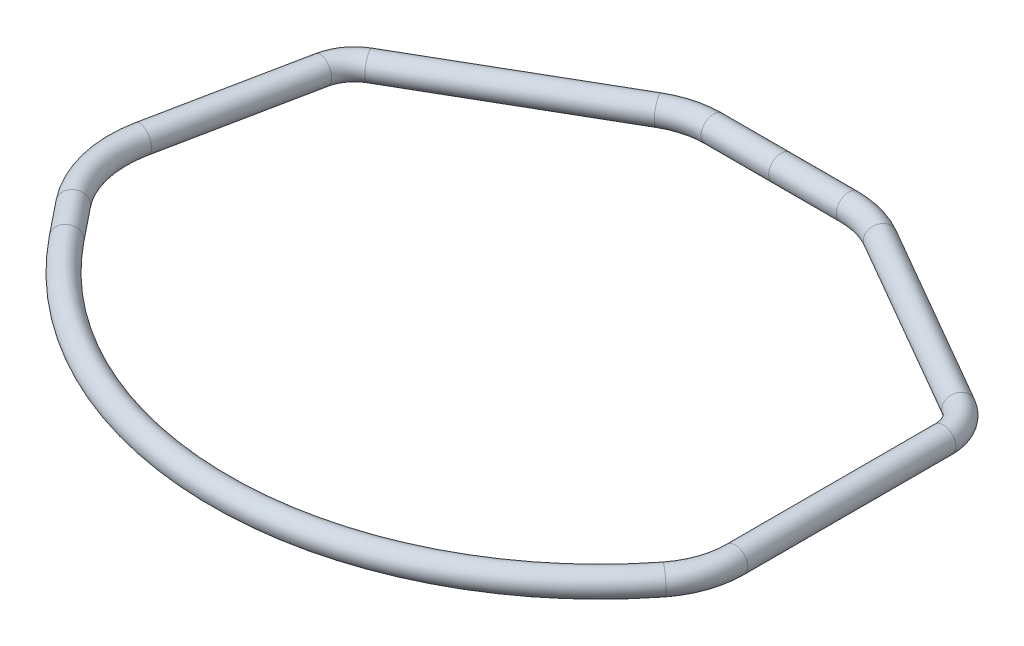
ISO-10303-21;
HEADER;
FILE_DESCRIPTION(('STEP AP214'),'2;1');
FILE_NAME('part.step','',(''),(''),'','','');
FILE_SCHEMA(('AUTOMOTIVE_DESIGN { 1 0 10303 214 1 1 1 1 }'));
ENDSEC;
DATA;
#1=APPLICATION_CONTEXT('core data for automotive mechanical design processes');
#2=APPLICATION_PROTOCOL_DEFINITION('international standard','automotive_design',2000,#1);
#3=PRODUCT_CONTEXT('',#1,'mechanical');
#4=PRODUCT('Part','Part','',(#3));
#5=PRODUCT_RELATED_PRODUCT_CATEGORY('part','',(#4));
#6=PRODUCT_DEFINITION_FORMATION('','',#4);
#7=PRODUCT_DEFINITION_CONTEXT('part definition',#1,'design');
#8=PRODUCT_DEFINITION('design','',#6,#7);
#9=PRODUCT_DEFINITION_SHAPE('','',#8);
#10=(LENGTH_UNIT() NAMED_UNIT(*) SI_UNIT(.MILLI.,.METRE.));
#11=(NAMED_UNIT(*) PLANE_ANGLE_UNIT() SI_UNIT($,.RADIAN.));
#12=(NAMED_UNIT(*) SI_UNIT($,.STERADIAN.) SOLID_ANGLE_UNIT());
#13=UNCERTAINTY_MEASURE_WITH_UNIT(LENGTH_MEASURE(1.E-05),#10,'distance_accuracy_value','');
#14=(GEOMETRIC_REPRESENTATION_CONTEXT(3) GLOBAL_UNCERTAINTY_ASSIGNED_CONTEXT((#13)) GLOBAL_UNIT_ASSIGNED_CONTEXT((#10,
#11,#12)) REPRESENTATION_CONTEXT('',''));
#15=CARTESIAN_POINT('',(0.,0.,0.));
#16=DIRECTION('',(0.,0.,1.));
#17=DIRECTION('',(1.,0.,0.));
#18=AXIS2_PLACEMENT_3D('',#15,#16,#17);
#19=CARTESIAN_POINT('',(0.,-2.64007996799996,-79.1865173669104));
#20=DIRECTION('',(-1.,0.,0.));
#21=DIRECTION('',(0.,0.,1.));
#22=AXIS2_PLACEMENT_3D('',#19,#20,#21);
#23=CYLINDRICAL_SURFACE('',#22,3.49249999999999);
#24=CARTESIAN_POINT('',(-19.0587163068293,-2.64007996799996,-79.1865173669104));
#25=DIRECTION('',(1.,0.,0.));
#26=DIRECTION('',(0.,0.,-1.));
#27=AXIS2_PLACEMENT_3D('',#24,#25,#26);
#28=CIRCLE('',#27,3.49249999999999);
#29=CARTESIAN_POINT('',(-19.0587163068293,-2.64007996799996,-82.6790173669104));
#30=VERTEX_POINT('',#29);
#31=EDGE_CURVE('E75',#30,#30,#28,.T.);
#32=ORIENTED_EDGE('',*,*,#31,.T.);
#33=EDGE_LOOP('',(#32));
#34=FACE_BOUND('',#33,.T.);
#35=CARTESIAN_POINT('',(0.,-2.64007996799996,-79.1865173669104));
#36=DIRECTION('',(1.,0.,0.));
#37=DIRECTION('',(0.,0.,-1.));
#38=AXIS2_PLACEMENT_3D('',#35,#36,#37);
#39=CIRCLE('',#38,3.49249999999999);
#40=CARTESIAN_POINT('',(0.,-2.64007996799996,-82.6790173669104));
#41=VERTEX_POINT('',#40);
#42=EDGE_CURVE('E78',#41,#41,#39,.T.);
#43=ORIENTED_EDGE('',*,*,#42,.F.);
#44=EDGE_LOOP('',(#43));
#45=FACE_BOUND('',#44,.T.);
#46=ADVANCED_FACE('F31',(#34,#45),#23,.T.);
#47=CARTESIAN_POINT('',(-19.0587163068293,-2.64007996799997,-54.864));
#48=DIRECTION('',(0.,1.,0.));
#49=DIRECTION('',(0.,0.,1.));
#50=AXIS2_PLACEMENT_3D('',#47,#48,#49);
#51=TOROIDAL_SURFACE('',#50,24.3225173669104,3.49249999999999);
#52=CARTESIAN_POINT('',(-31.2199749902845,-2.64007996799996,-75.9279179237326));
#53=DIRECTION('',(0.866025403784438,0.,-0.5));
#54=DIRECTION('',(-0.5,0.,-0.866025403784438));
#55=AXIS2_PLACEMENT_3D('',#52,#53,#54);
#56=CIRCLE('',#55,3.49249999999999);
#57=CARTESIAN_POINT('',(-32.9662249902845,-2.64007996799996,-78.9525116464498));
#58=VERTEX_POINT('',#57);
#59=EDGE_CURVE('E72',#58,#58,#56,.T.);
#60=CARTESIAN_POINT('',(-19.0587163068293,-2.64007996799997,-54.864));
#61=DIRECTION('',(0.,1.,0.));
#62=DIRECTION('',(0.,0.,1.));
#63=AXIS2_PLACEMENT_3D('',#60,#61,#62);
#64=CIRCLE('',#63,27.8150173669104);
#65=EDGE_CURVE('',#30,#58,#64,.T.);
#66=ORIENTED_EDGE('',*,*,#31,.F.);
#67=ORIENTED_EDGE('',*,*,#59,.T.);
#68=ORIENTED_EDGE('',*,*,#65,.T.);
#69=ORIENTED_EDGE('',*,*,#65,.F.);
#70=EDGE_LOOP('',(#66,#68,#67,#69));
#71=FACE_BOUND('',#70,.T.);
#72=ADVANCED_FACE('F85',(#71),#51,.T.);
#73=CARTESIAN_POINT('',(-31.2199749902845,-2.64007996799996,-75.9279179237327));
#74=DIRECTION('',(-0.866025403784438,0.,0.5));
#75=DIRECTION('',(0.5,0.,0.866025403784439));
#76=AXIS2_PLACEMENT_3D('',#73,#74,#75);
#77=CYLINDRICAL_SURFACE('',#76,3.49249999999999);
#78=CARTESIAN_POINT('',(-82.9748700660675,-2.64007996799997,-46.0472153198485));
#79=DIRECTION('',(0.866025403784438,0.,-0.500000000000001));
#80=DIRECTION('',(-0.5,0.,-0.866025403784438));
#81=AXIS2_PLACEMENT_3D('',#78,#79,#80);
#82=CIRCLE('',#81,3.49249999999999);
#83=CARTESIAN_POINT('',(-84.7211200660675,-2.64007996799997,-49.0718090425656));
#84=VERTEX_POINT('',#83);
#85=EDGE_CURVE('E69',#84,#84,#82,.T.);
#86=ORIENTED_EDGE('',*,*,#85,.T.);
#87=EDGE_LOOP('',(#86));
#88=FACE_BOUND('',#87,.T.);
#89=ORIENTED_EDGE('',*,*,#59,.F.);
#90=EDGE_LOOP('',(#89));
#91=FACE_BOUND('',#90,.T.);
#92=ADVANCED_FACE('F91',(#88,#91),#77,.T.);
#93=CARTESIAN_POINT('',(-77.1636113826123,-2.64007996799997,-35.9818200241782));
#94=DIRECTION('',(0.,1.,0.));
#95=DIRECTION('',(0.,0.,1.));
#96=AXIS2_PLACEMENT_3D('',#93,#94,#95);
#97=TOROIDAL_SURFACE('',#96,11.6225173669104,3.49249999999999);
#98=CARTESIAN_POINT('',(-88.5554158251635,-2.64007996799997,-38.2860989757821));
#99=DIRECTION('',(0.198259884572355,0.,-0.980149487664691));
#100=DIRECTION('',(-0.980149487664691,0.,-0.198259884572355));
#101=AXIS2_PLACEMENT_3D('',#98,#99,#100);
#102=CIRCLE('',#101,3.49249999999999);
#103=CARTESIAN_POINT('',(-91.9785879108324,-2.64007996799997,-38.978521622651));
#104=VERTEX_POINT('',#103);
#105=EDGE_CURVE('E66',#104,#104,#102,.T.);
#106=CARTESIAN_POINT('',(-77.1636113826123,-2.64007996799997,-35.9818200241782));
#107=DIRECTION('',(0.,1.,0.));
#108=DIRECTION('',(0.,0.,1.));
#109=AXIS2_PLACEMENT_3D('',#106,#107,#108);
#110=CIRCLE('',#109,15.1150173669104);
#111=EDGE_CURVE('',#84,#104,#110,.T.);
#112=ORIENTED_EDGE('',*,*,#85,.F.);
#113=ORIENTED_EDGE('',*,*,#105,.T.);
#114=ORIENTED_EDGE('',*,*,#111,.T.);
#115=ORIENTED_EDGE('',*,*,#111,.F.);
#116=EDGE_LOOP('',(#112,#114,#113,#115));
#117=FACE_BOUND('',#116,.T.);
#118=ADVANCED_FACE('F97',(#117),#97,.T.);
#119=CARTESIAN_POINT('',(-88.5554158251635,-2.64007996799997,-38.2860989757821));
#120=DIRECTION('',(-0.198259884572355,0.,0.980149487664691));
#121=DIRECTION('',(0.980149487664691,0.,0.198259884572355));
#122=AXIS2_PLACEMENT_3D('',#119,#120,#121);
#123=CYLINDRICAL_SURFACE('',#122,3.49249999999999);
#124=CARTESIAN_POINT('',(-97.1146101524304,-2.64007996799998,4.02851223661143));
#125=DIRECTION('',(0.198259884572355,0.,-0.980149487664691));
#126=DIRECTION('',(-0.980149487664691,0.,-0.198259884572355));
#127=AXIS2_PLACEMENT_3D('',#124,#125,#126);
#128=CIRCLE('',#127,3.49249999999999);
#129=CARTESIAN_POINT('',(-100.537782238099,-2.64007996799998,3.33608958974249));
#130=VERTEX_POINT('',#129);
#131=EDGE_CURVE('E63',#130,#130,#128,.T.);
#132=ORIENTED_EDGE('',*,*,#131,.T.);
#133=EDGE_LOOP('',(#132));
#134=FACE_BOUND('',#133,.T.);
#135=ORIENTED_EDGE('',*,*,#105,.F.);
#136=EDGE_LOOP('',(#135));
#137=FACE_BOUND('',#136,.T.);
#138=ADVANCED_FACE('F101',(#134,#137),#123,.T.);
#139=CARTESIAN_POINT('',(-66.802,-2.64007996799998,10.16));
#140=DIRECTION('',(0.,1.,0.));
#141=DIRECTION('',(0.,0.,1.));
#142=AXIS2_PLACEMENT_3D('',#139,#140,#141);
#143=TOROIDAL_SURFACE('',#142,30.9265173669104,3.49249999999999);
#144=CARTESIAN_POINT('',(-90.9218669859199,-2.64007996799999,29.5166911693952));
#145=DIRECTION('',(-0.625893014067784,0.,-0.779908927337766));
#146=DIRECTION('',(-0.779908927337766,0.,0.625893014067784));
#147=AXIS2_PLACEMENT_3D('',#144,#145,#146);
#148=CIRCLE('',#147,3.49249999999999);
#149=CARTESIAN_POINT('',(-93.6456989146471,-2.64007996799999,31.702622521027));
#150=VERTEX_POINT('',#149);
#151=EDGE_CURVE('E60',#150,#150,#148,.T.);
#152=CARTESIAN_POINT('',(-66.802,-2.64007996799998,10.16));
#153=DIRECTION('',(0.,1.,0.));
#154=DIRECTION('',(0.,0.,1.));
#155=AXIS2_PLACEMENT_3D('',#152,#153,#154);
#156=CIRCLE('',#155,34.4190173669104);
#157=EDGE_CURVE('',#130,#150,#156,.T.);
#158=ORIENTED_EDGE('',*,*,#131,.F.);
#159=ORIENTED_EDGE('',*,*,#151,.T.);
#160=ORIENTED_EDGE('',*,*,#157,.T.);
#161=ORIENTED_EDGE('',*,*,#157,.F.);
#162=EDGE_LOOP('',(#158,#160,#159,#161));
#163=FACE_BOUND('',#162,.T.);
#164=ADVANCED_FACE('F105',(#163),#143,.T.);
#165=CARTESIAN_POINT('',(-90.9218669859199,-2.64007996799999,29.5166911693952));
#166=DIRECTION('',(0.625893014067785,0.,0.779908927337765));
#167=DIRECTION('',(0.779908927337765,0.,-0.625893014067785));
#168=AXIS2_PLACEMENT_3D('',#165,#166,#167);
#169=CYLINDRICAL_SURFACE('',#168,3.49249999999999);
#170=CARTESIAN_POINT('',(-83.3508303815139,-2.64007996799999,38.9507620157872));
#171=DIRECTION('',(-0.625893014067785,0.,-0.779908927337765));
#172=DIRECTION('',(-0.779908927337765,0.,0.625893014067785));
#173=AXIS2_PLACEMENT_3D('',#170,#171,#172);
#174=CIRCLE('',#173,3.49249999999999);
#175=CARTESIAN_POINT('',(-86.074662310241,-2.64007996799999,41.1366933674189));
#176=VERTEX_POINT('',#175);
#177=EDGE_CURVE('E57',#176,#176,#174,.T.);
#178=ORIENTED_EDGE('',*,*,#177,.T.);
#179=EDGE_LOOP('',(#178));
#180=FACE_BOUND('',#179,.T.);
#181=ORIENTED_EDGE('',*,*,#151,.F.);
#182=EDGE_LOOP('',(#181));
#183=FACE_BOUND('',#182,.T.);
#184=ADVANCED_FACE('F109',(#180,#183),#169,.T.);
#185=CARTESIAN_POINT('',(0.,-2.64007996799997,-27.94));
#186=DIRECTION('',(0.,1.,0.));
#187=DIRECTION('',(0.,0.,1.));
#188=AXIS2_PLACEMENT_3D('',#185,#186,#187);
#189=TOROIDAL_SURFACE('',#188,106.87251736691,3.49249999999999);
#190=CARTESIAN_POINT('',(84.1185623765992,-2.64007996799999,37.9827004303886));
#191=DIRECTION('',(-0.616834917475233,0.,0.787092551472394));
#192=DIRECTION('',(0.787092551472394,0.,0.616834917475233));
#193=AXIS2_PLACEMENT_3D('',#190,#191,#192);
#194=CIRCLE('',#193,3.49249999999999);
#195=CARTESIAN_POINT('',(86.8674831126165,-2.64007996799999,40.1369963796708));
#196=VERTEX_POINT('',#195);
#197=EDGE_CURVE('E54',#196,#196,#194,.T.);
#198=CARTESIAN_POINT('',(0.,-2.64007996799997,-27.94));
#199=DIRECTION('',(0.,1.,0.));
#200=DIRECTION('',(0.,0.,1.));
#201=AXIS2_PLACEMENT_3D('',#198,#199,#200);
#202=CIRCLE('',#201,110.36501736691);
#203=EDGE_CURVE('',#176,#196,#202,.T.);
#204=ORIENTED_EDGE('',*,*,#177,.F.);
#205=ORIENTED_EDGE('',*,*,#197,.T.);
#206=ORIENTED_EDGE('',*,*,#203,.T.);
#207=ORIENTED_EDGE('',*,*,#203,.F.);
#208=EDGE_LOOP('',(#204,#206,#205,#207));
#209=FACE_BOUND('',#208,.T.);
#210=ADVANCED_FACE('F113',(#209),#189,.T.);
#211=CARTESIAN_POINT('',(64.9744901240461,-2.64007996799998,22.9797224375804));
#212=DIRECTION('',(0.,1.,0.));
#213=DIRECTION('',(0.,0.,1.));
#214=AXIS2_PLACEMENT_3D('',#211,#212,#213);
#215=TOROIDAL_SURFACE('',#214,24.3225173669104,3.49249999999999);
#216=CARTESIAN_POINT('',(89.2970074909565,-2.64007996799998,22.9797224375804));
#217=DIRECTION('',(0.,0.,1.));
#218=DIRECTION('',(1.,0.,0.));
#219=AXIS2_PLACEMENT_3D('',#216,#217,#218);
#220=CIRCLE('',#219,3.49249999999999);
#221=CARTESIAN_POINT('',(92.7895074909566,-2.64007996799998,22.9797224375804));
#222=VERTEX_POINT('',#221);
#223=EDGE_CURVE('E51',#222,#222,#220,.T.);
#224=CARTESIAN_POINT('',(64.9744901240461,-2.64007996799998,22.9797224375804));
#225=DIRECTION('',(0.,1.,0.));
#226=DIRECTION('',(0.,0.,1.));
#227=AXIS2_PLACEMENT_3D('',#224,#225,#226);
#228=CIRCLE('',#227,27.8150173669104);
#229=EDGE_CURVE('',#196,#222,#228,.T.);
#230=ORIENTED_EDGE('',*,*,#197,.F.);
#231=ORIENTED_EDGE('',*,*,#223,.T.);
#232=ORIENTED_EDGE('',*,*,#229,.T.);
#233=ORIENTED_EDGE('',*,*,#229,.F.);
#234=EDGE_LOOP('',(#230,#232,#231,#233));
#235=FACE_BOUND('',#234,.T.);
#236=ADVANCED_FACE('F117',(#235),#215,.T.);
#237=CARTESIAN_POINT('',(89.2970074909565,-2.64007996799998,22.9797224375804));
#238=DIRECTION('',(0.,0.,-1.));
#239=DIRECTION('',(-1.,0.,0.));
#240=AXIS2_PLACEMENT_3D('',#237,#238,#239);
#241=CYLINDRICAL_SURFACE('',#240,3.49249999999999);
#242=CARTESIAN_POINT('',(89.2970074909565,-2.64007996799997,-35.6868640452882));
#243=DIRECTION('',(0.,0.,1.));
#244=DIRECTION('',(1.,0.,0.));
#245=AXIS2_PLACEMENT_3D('',#242,#243,#244);
#246=CIRCLE('',#245,3.49249999999999);
#247=CARTESIAN_POINT('',(92.7895074909565,-2.64007996799997,-35.6868640452882));
#248=VERTEX_POINT('',#247);
#249=EDGE_CURVE('E46',#248,#248,#246,.T.);
#250=ORIENTED_EDGE('',*,*,#249,.T.);
#251=EDGE_LOOP('',(#250));
#252=FACE_BOUND('',#251,.T.);
#253=ORIENTED_EDGE('',*,*,#223,.F.);
#254=EDGE_LOOP('',(#253));
#255=FACE_BOUND('',#254,.T.);
#256=ADVANCED_FACE('F121',(#252,#255),#241,.T.);
#257=CARTESIAN_POINT('',(77.6744901240461,-2.64007996799997,-35.6868640452882));
#258=DIRECTION('',(0.,1.,0.));
#259=DIRECTION('',(0.,0.,1.));
#260=AXIS2_PLACEMENT_3D('',#257,#258,#259);
#261=TOROIDAL_SURFACE('',#260,11.6225173669104,3.49249999999999);
#262=CARTESIAN_POINT('',(83.4857488075013,-2.64007996799997,-45.7522593409584));
#263=DIRECTION('',(0.866025403784439,0.,0.5));
#264=DIRECTION('',(0.5,0.,-0.866025403784439));
#265=AXIS2_PLACEMENT_3D('',#262,#263,#264);
#266=CIRCLE('',#265,3.49249999999999);
#267=CARTESIAN_POINT('',(85.2319988075013,-2.64007996799997,-48.7768530636756));
#268=VERTEX_POINT('',#267);
#269=EDGE_CURVE('E42',#268,#268,#266,.T.);
#270=CARTESIAN_POINT('',(77.6744901240461,-2.64007996799997,-35.6868640452882));
#271=DIRECTION('',(0.,1.,0.));
#272=DIRECTION('',(0.,0.,1.));
#273=AXIS2_PLACEMENT_3D('',#270,#271,#272);
#274=CIRCLE('',#273,15.1150173669104);
#275=EDGE_CURVE('',#248,#268,#274,.T.);
#276=ORIENTED_EDGE('',*,*,#249,.F.);
#277=ORIENTED_EDGE('',*,*,#269,.T.);
#278=ORIENTED_EDGE('',*,*,#275,.T.);
#279=ORIENTED_EDGE('',*,*,#275,.F.);
#280=EDGE_LOOP('',(#276,#278,#277,#279));
#281=FACE_BOUND('',#280,.T.);
#282=ADVANCED_FACE('F125',(#281),#261,.T.);
#283=CARTESIAN_POINT('',(83.4857488075013,-2.64007996799997,-45.7522593409584));
#284=DIRECTION('',(-0.866025403784438,0.,-0.500000000000001));
#285=DIRECTION('',(-0.500000000000001,0.,0.866025403784438));
#286=AXIS2_PLACEMENT_3D('',#283,#284,#285);
#287=CYLINDRICAL_SURFACE('',#286,3.49249999999999);
#288=CARTESIAN_POINT('',(31.2199749902847,-2.64007996799996,-75.9279179237326));
#289=DIRECTION('',(0.866025403784438,0.,0.500000000000001));
#290=DIRECTION('',(0.500000000000001,0.,-0.866025403784438));
#291=AXIS2_PLACEMENT_3D('',#288,#289,#290);
#292=CIRCLE('',#291,3.49249999999999);
#293=CARTESIAN_POINT('',(32.9662249902847,-2.64007996799996,-78.9525116464498));
#294=VERTEX_POINT('',#293);
#295=EDGE_CURVE('E38',#294,#294,#292,.T.);
#296=ORIENTED_EDGE('',*,*,#295,.T.);
#297=EDGE_LOOP('',(#296));
#298=FACE_BOUND('',#297,.T.);
#299=ORIENTED_EDGE('',*,*,#269,.F.);
#300=EDGE_LOOP('',(#299));
#301=FACE_BOUND('',#300,.T.);
#302=ADVANCED_FACE('F129',(#298,#301),#287,.T.);
#303=CARTESIAN_POINT('',(19.0587163068295,-2.64007996799997,-54.864));
#304=DIRECTION('',(0.,1.,0.));
#305=DIRECTION('',(0.,0.,1.));
#306=AXIS2_PLACEMENT_3D('',#303,#304,#305);
#307=TOROIDAL_SURFACE('',#306,24.3225173669104,3.49249999999999);
#308=CARTESIAN_POINT('',(19.0587163068295,-2.64007996799996,-79.1865173669104));
#309=DIRECTION('',(1.,0.,0.));
#310=DIRECTION('',(0.,0.,-1.));
#311=AXIS2_PLACEMENT_3D('',#308,#309,#310);
#312=CIRCLE('',#311,3.49249999999999);
#313=CARTESIAN_POINT('',(19.0587163068295,-2.64007996799996,-82.6790173669104));
#314=VERTEX_POINT('',#313);
#315=EDGE_CURVE('E10',#314,#314,#312,.T.);
#316=CARTESIAN_POINT('',(19.0587163068295,-2.64007996799997,-54.864));
#317=DIRECTION('',(0.,1.,0.));
#318=DIRECTION('',(0.,0.,1.));
#319=AXIS2_PLACEMENT_3D('',#316,#317,#318);
#320=CIRCLE('',#319,27.8150173669104);
#321=EDGE_CURVE('',#294,#314,#320,.T.);
#322=ORIENTED_EDGE('',*,*,#295,.F.);
#323=ORIENTED_EDGE('',*,*,#315,.T.);
#324=ORIENTED_EDGE('',*,*,#321,.T.);
#325=ORIENTED_EDGE('',*,*,#321,.F.);
#326=EDGE_LOOP('',(#322,#324,#323,#325));
#327=FACE_BOUND('',#326,.T.);
#328=ADVANCED_FACE('F132',(#327),#307,.T.);
#329=CARTESIAN_POINT('',(19.0587163068295,-2.64007996799996,-79.1865173669104));
#330=DIRECTION('',(-1.,0.,0.));
#331=DIRECTION('',(0.,0.,1.));
#332=AXIS2_PLACEMENT_3D('',#329,#330,#331);
#333=CYLINDRICAL_SURFACE('',#332,3.49249999999999);
#334=ORIENTED_EDGE('',*,*,#42,.T.);
#335=EDGE_LOOP('',(#334));
#336=FACE_BOUND('',#335,.T.);
#337=ORIENTED_EDGE('',*,*,#315,.F.);
#338=EDGE_LOOP('',(#337));
#339=FACE_BOUND('',#338,.T.);
#340=ADVANCED_FACE('F33',(#336,#339),#333,.T.);
#341=CLOSED_SHELL('',(#46,#72,#92,#118,#138,#164,#184,#210,#236,#256,#282,#302,#328,#340));
#342=MANIFOLD_SOLID_BREP('B2',#341);
#343=ADVANCED_BREP_SHAPE_REPRESENTATION('',(#18,#342),#14);
#344=SHAPE_DEFINITION_REPRESENTATION(#9,#343);
ENDSEC;
END-ISO-10303-21;
